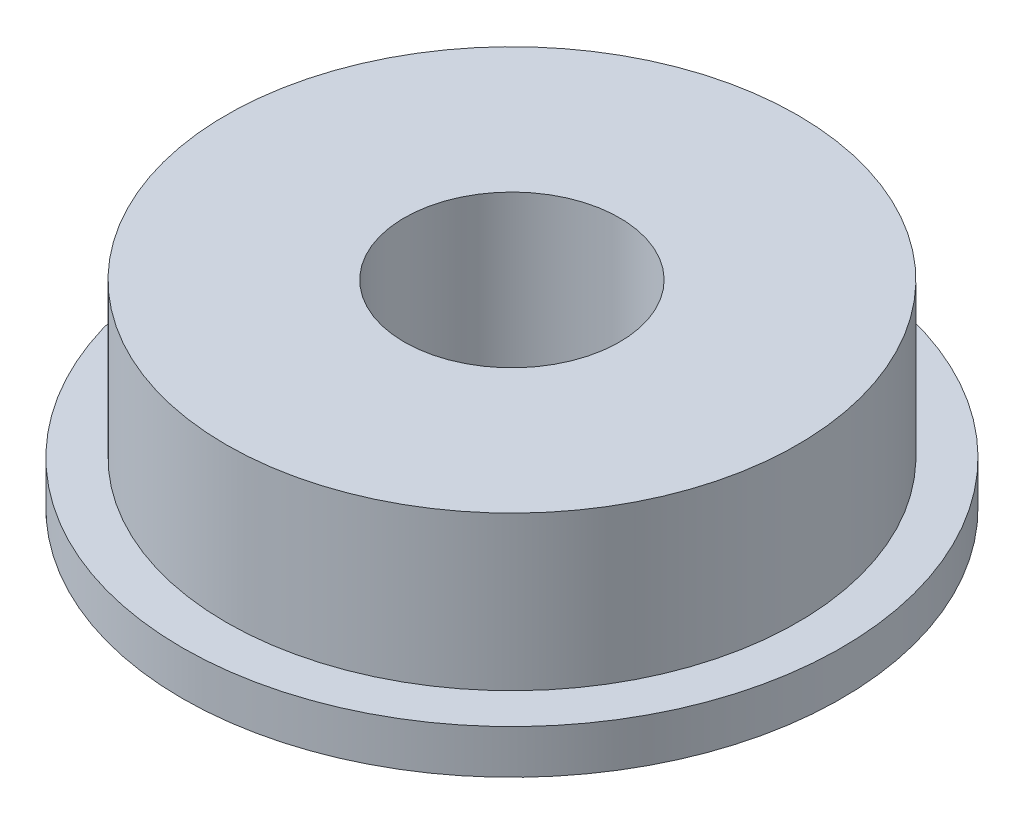
ISO-10303-21;
HEADER;
FILE_DESCRIPTION(('STEP AP214'),'2;1');
FILE_NAME('part.step','',(''),(''),'','','');
FILE_SCHEMA(('AUTOMOTIVE_DESIGN { 1 0 10303 214 1 1 1 1 }'));
ENDSEC;
DATA;
#1=APPLICATION_CONTEXT('core data for automotive mechanical design processes');
#2=APPLICATION_PROTOCOL_DEFINITION('international standard','automotive_design',2000,#1);
#3=PRODUCT_CONTEXT('',#1,'mechanical');
#4=PRODUCT('Part','Part','',(#3));
#5=PRODUCT_RELATED_PRODUCT_CATEGORY('part','',(#4));
#6=PRODUCT_DEFINITION_FORMATION('','',#4);
#7=PRODUCT_DEFINITION_CONTEXT('part definition',#1,'design');
#8=PRODUCT_DEFINITION('design','',#6,#7);
#9=PRODUCT_DEFINITION_SHAPE('','',#8);
#10=(LENGTH_UNIT() NAMED_UNIT(*) SI_UNIT(.MILLI.,.METRE.));
#11=(NAMED_UNIT(*) PLANE_ANGLE_UNIT() SI_UNIT($,.RADIAN.));
#12=(NAMED_UNIT(*) SI_UNIT($,.STERADIAN.) SOLID_ANGLE_UNIT());
#13=UNCERTAINTY_MEASURE_WITH_UNIT(LENGTH_MEASURE(1.E-05),#10,'distance_accuracy_value','');
#14=(GEOMETRIC_REPRESENTATION_CONTEXT(3) GLOBAL_UNCERTAINTY_ASSIGNED_CONTEXT((#13)) GLOBAL_UNIT_ASSIGNED_CONTEXT((#10,
#11,#12)) REPRESENTATION_CONTEXT('',''));
#15=CARTESIAN_POINT('',(0.,0.,0.));
#16=DIRECTION('',(0.,0.,1.));
#17=DIRECTION('',(1.,0.,0.));
#18=AXIS2_PLACEMENT_3D('',#15,#16,#17);
#19=CARTESIAN_POINT('',(0.,1.,0.));
#20=DIRECTION('',(0.,-1.,0.));
#21=DIRECTION('',(0.,0.,-1.));
#22=AXIS2_PLACEMENT_3D('',#19,#20,#21);
#23=CYLINDRICAL_SURFACE('',#22,7.5);
#24=CARTESIAN_POINT('',(0.,1.,0.));
#25=DIRECTION('',(0.,1.,0.));
#26=DIRECTION('',(0.,0.,1.));
#27=AXIS2_PLACEMENT_3D('',#24,#25,#26);
#28=CIRCLE('',#27,7.5);
#29=CARTESIAN_POINT('',(0.,1.,7.5));
#30=VERTEX_POINT('',#29);
#31=EDGE_CURVE('E44',#30,#30,#28,.T.);
#32=ORIENTED_EDGE('',*,*,#31,.F.);
#33=EDGE_LOOP('',(#32));
#34=FACE_BOUND('',#33,.T.);
#35=CARTESIAN_POINT('',(0.,0.,0.));
#36=DIRECTION('',(0.,1.,0.));
#37=DIRECTION('',(0.,0.,1.));
#38=AXIS2_PLACEMENT_3D('',#35,#36,#37);
#39=CIRCLE('',#38,7.5);
#40=CARTESIAN_POINT('',(0.,0.,7.5));
#41=VERTEX_POINT('',#40);
#42=EDGE_CURVE('E39',#41,#41,#39,.T.);
#43=ORIENTED_EDGE('',*,*,#42,.T.);
#44=EDGE_LOOP('',(#43));
#45=FACE_BOUND('',#44,.T.);
#46=ADVANCED_FACE('F36',(#34,#45),#23,.T.);
#47=CARTESIAN_POINT('',(0.,1.,0.));
#48=DIRECTION('',(0.,1.,0.));
#49=DIRECTION('',(0.,0.,1.));
#50=AXIS2_PLACEMENT_3D('',#47,#48,#49);
#51=PLANE('',#50);
#52=CARTESIAN_POINT('',(0.,1.,0.));
#53=DIRECTION('',(0.,1.,0.));
#54=DIRECTION('',(0.,0.,1.));
#55=AXIS2_PLACEMENT_3D('',#52,#53,#54);
#56=CIRCLE('',#55,6.5);
#57=CARTESIAN_POINT('',(0.,1.,6.5));
#58=VERTEX_POINT('',#57);
#59=EDGE_CURVE('E10',#58,#58,#56,.T.);
#60=ORIENTED_EDGE('',*,*,#59,.F.);
#61=EDGE_LOOP('',(#60));
#62=FACE_BOUND('',#61,.T.);
#63=ORIENTED_EDGE('',*,*,#31,.T.);
#64=EDGE_LOOP('',(#63));
#65=FACE_BOUND('',#64,.T.);
#66=ADVANCED_FACE('F81',(#62,#65),#51,.T.);
#67=CARTESIAN_POINT('',(0.,0.,0.));
#68=DIRECTION('',(0.,1.,0.));
#69=DIRECTION('',(0.,0.,1.));
#70=AXIS2_PLACEMENT_3D('',#67,#68,#69);
#71=PLANE('',#70);
#72=CARTESIAN_POINT('',(0.,0.,0.));
#73=DIRECTION('',(0.,1.,0.));
#74=DIRECTION('',(0.,0.,1.));
#75=AXIS2_PLACEMENT_3D('',#72,#73,#74);
#76=CIRCLE('',#75,2.45);
#77=CARTESIAN_POINT('',(0.,0.,2.45));
#78=VERTEX_POINT('',#77);
#79=EDGE_CURVE('E55',#78,#78,#76,.F.);
#80=ORIENTED_EDGE('',*,*,#79,.F.);
#81=EDGE_LOOP('',(#80));
#82=FACE_BOUND('',#81,.T.);
#83=ORIENTED_EDGE('',*,*,#42,.F.);
#84=EDGE_LOOP('',(#83));
#85=FACE_BOUND('',#84,.T.);
#86=ADVANCED_FACE('F74',(#82,#85),#71,.F.);
#87=CARTESIAN_POINT('',(0.,4.5,0.));
#88=DIRECTION('',(0.,-1.,0.));
#89=DIRECTION('',(0.,0.,-1.));
#90=AXIS2_PLACEMENT_3D('',#87,#88,#89);
#91=CYLINDRICAL_SURFACE('',#90,6.5);
#92=CARTESIAN_POINT('',(0.,4.5,0.));
#93=DIRECTION('',(0.,1.,0.));
#94=DIRECTION('',(0.,0.,1.));
#95=AXIS2_PLACEMENT_3D('',#92,#93,#94);
#96=CIRCLE('',#95,6.5);
#97=CARTESIAN_POINT('',(0.,4.5,6.5));
#98=VERTEX_POINT('',#97);
#99=EDGE_CURVE('E51',#98,#98,#96,.T.);
#100=ORIENTED_EDGE('',*,*,#99,.F.);
#101=EDGE_LOOP('',(#100));
#102=FACE_BOUND('',#101,.T.);
#103=ORIENTED_EDGE('',*,*,#59,.T.);
#104=EDGE_LOOP('',(#103));
#105=FACE_BOUND('',#104,.T.);
#106=ADVANCED_FACE('F69',(#102,#105),#91,.T.);
#107=CARTESIAN_POINT('',(0.,4.5,0.));
#108=DIRECTION('',(0.,1.,0.));
#109=DIRECTION('',(0.,0.,1.));
#110=AXIS2_PLACEMENT_3D('',#107,#108,#109);
#111=PLANE('',#110);
#112=CARTESIAN_POINT('',(0.,4.5,0.));
#113=DIRECTION('',(0.,1.,0.));
#114=DIRECTION('',(0.,0.,1.));
#115=AXIS2_PLACEMENT_3D('',#112,#113,#114);
#116=CIRCLE('',#115,2.45);
#117=CARTESIAN_POINT('',(0.,4.5,2.45));
#118=VERTEX_POINT('',#117);
#119=EDGE_CURVE('E59',#118,#118,#116,.T.);
#120=ORIENTED_EDGE('',*,*,#119,.F.);
#121=EDGE_LOOP('',(#120));
#122=FACE_BOUND('',#121,.T.);
#123=ORIENTED_EDGE('',*,*,#99,.T.);
#124=EDGE_LOOP('',(#123));
#125=FACE_BOUND('',#124,.T.);
#126=ADVANCED_FACE('F66',(#122,#125),#111,.T.);
#127=CARTESIAN_POINT('',(0.,-6.92964645562817,0.));
#128=DIRECTION('',(0.,1.,0.));
#129=DIRECTION('',(0.,0.,1.));
#130=AXIS2_PLACEMENT_3D('',#127,#128,#129);
#131=CYLINDRICAL_SURFACE('',#130,2.45);
#132=CARTESIAN_POINT('',(0.,0.,2.45));
#133=CARTESIAN_POINT('',(0.,0.0468749999999992,2.45));
#134=CARTESIAN_POINT('',(0.,0.0937499999999992,2.45));
#135=CARTESIAN_POINT('',(0.,0.187499999999999,2.45));
#136=CARTESIAN_POINT('',(0.,0.234374999999999,2.45));
#137=CARTESIAN_POINT('',(0.,0.328124999999999,2.45));
#138=CARTESIAN_POINT('',(0.,0.374999999999999,2.45));
#139=CARTESIAN_POINT('',(0.,0.46875,2.45));
#140=CARTESIAN_POINT('',(0.,0.515625,2.45));
#141=CARTESIAN_POINT('',(0.,0.609374999999999,2.45));
#142=CARTESIAN_POINT('',(0.,0.656249999999999,2.45));
#143=CARTESIAN_POINT('',(0.,0.749999999999999,2.45));
#144=CARTESIAN_POINT('',(0.,0.796874999999999,2.45));
#145=CARTESIAN_POINT('',(0.,0.890624999999999,2.45));
#146=CARTESIAN_POINT('',(0.,0.937499999999998,2.45));
#147=CARTESIAN_POINT('',(0.,1.03125,2.45));
#148=CARTESIAN_POINT('',(0.,1.078125,2.45));
#149=CARTESIAN_POINT('',(0.,1.171875,2.45));
#150=CARTESIAN_POINT('',(0.,1.21875,2.45));
#151=CARTESIAN_POINT('',(0.,1.3125,2.45));
#152=CARTESIAN_POINT('',(0.,1.359375,2.45));
#153=CARTESIAN_POINT('',(0.,1.453125,2.45));
#154=CARTESIAN_POINT('',(0.,1.5,2.45));
#155=CARTESIAN_POINT('',(0.,1.59375,2.45));
#156=CARTESIAN_POINT('',(0.,1.640625,2.45));
#157=CARTESIAN_POINT('',(0.,1.734375,2.45));
#158=CARTESIAN_POINT('',(0.,1.78125,2.45));
#159=CARTESIAN_POINT('',(0.,1.875,2.45));
#160=CARTESIAN_POINT('',(0.,1.921875,2.45));
#161=CARTESIAN_POINT('',(0.,2.015625,2.45));
#162=CARTESIAN_POINT('',(0.,2.0625,2.45));
#163=CARTESIAN_POINT('',(0.,2.15625,2.45));
#164=CARTESIAN_POINT('',(0.,2.203125,2.45));
#165=CARTESIAN_POINT('',(0.,2.296875,2.45));
#166=CARTESIAN_POINT('',(0.,2.34375,2.45));
#167=CARTESIAN_POINT('',(0.,2.4375,2.45));
#168=CARTESIAN_POINT('',(0.,2.484375,2.45));
#169=CARTESIAN_POINT('',(0.,2.578125,2.45));
#170=CARTESIAN_POINT('',(0.,2.625,2.45));
#171=CARTESIAN_POINT('',(0.,2.71875,2.45));
#172=CARTESIAN_POINT('',(0.,2.765625,2.45));
#173=CARTESIAN_POINT('',(0.,2.859375,2.45));
#174=CARTESIAN_POINT('',(0.,2.90625,2.45));
#175=CARTESIAN_POINT('',(0.,3.,2.45));
#176=CARTESIAN_POINT('',(0.,3.046875,2.45));
#177=CARTESIAN_POINT('',(0.,3.140625,2.45));
#178=CARTESIAN_POINT('',(0.,3.1875,2.45));
#179=CARTESIAN_POINT('',(0.,3.28125,2.45));
#180=CARTESIAN_POINT('',(0.,3.328125,2.45));
#181=CARTESIAN_POINT('',(0.,3.421875,2.45));
#182=CARTESIAN_POINT('',(0.,3.46875,2.45));
#183=CARTESIAN_POINT('',(0.,3.5625,2.45));
#184=CARTESIAN_POINT('',(0.,3.609375,2.45));
#185=CARTESIAN_POINT('',(0.,3.703125,2.45));
#186=CARTESIAN_POINT('',(0.,3.75,2.45));
#187=CARTESIAN_POINT('',(0.,3.84375,2.45));
#188=CARTESIAN_POINT('',(0.,3.890625,2.45));
#189=CARTESIAN_POINT('',(0.,3.984375,2.45));
#190=CARTESIAN_POINT('',(0.,4.03125,2.45));
#191=CARTESIAN_POINT('',(0.,4.125,2.45));
#192=CARTESIAN_POINT('',(0.,4.171875,2.45));
#193=CARTESIAN_POINT('',(0.,4.265625,2.45));
#194=CARTESIAN_POINT('',(0.,4.3125,2.45));
#195=CARTESIAN_POINT('',(0.,4.40625,2.45));
#196=CARTESIAN_POINT('',(0.,4.453125,2.45));
#197=CARTESIAN_POINT('',(0.,4.5,2.45));
#198=B_SPLINE_CURVE_WITH_KNOTS('',3,(#132,#133,#134,#135,#136,#137,#138,#139,#140,#141,#142,
#143,#144,#145,#146,#147,#148,#149,#150,#151,#152,#153,#154,#155,#156,#157,#158,#159,#160,#161,
#162,#163,#164,#165,#166,#167,#168,#169,#170,#171,#172,#173,#174,#175,#176,#177,#178,#179,#180,
#181,#182,#183,#184,#185,#186,#187,#188,#189,#190,#191,#192,#193,#194,#195,#196,#197),
.UNSPECIFIED.,.F.,.F.,(4,2,2,2,2,2,2,2,2,2,2,2,2,2,2,2,2,2,2,2,2,2,2,2,2,2,2,2,2,2,2,2,4),(0.,
0.140625,0.28125,0.421875,0.5625,0.703125,0.84375,0.984374999999998,1.125,1.265625,1.40625,
1.546875,1.6875,1.828125,1.96875,2.109375,2.25,2.390625,2.53125,2.671875,2.8125,2.953125,
3.09375,3.234375,3.375,3.515625,3.65625,3.796875,3.9375,4.078125,4.21875,4.359375,4.5),.UNSPECIFIED.);
#199=EDGE_CURVE('BSEAM64',#78,#118,#198,.T.);
#200=ORIENTED_EDGE('',*,*,#79,.T.);
#201=ORIENTED_EDGE('',*,*,#119,.T.);
#202=ORIENTED_EDGE('',*,*,#199,.T.);
#203=ORIENTED_EDGE('',*,*,#199,.F.);
#204=EDGE_LOOP('',(#200,#202,#201,#203));
#205=FACE_BOUND('',#204,.T.);
#206=ADVANCED_FACE('F64',(#205),#131,.F.);
#207=CLOSED_SHELL('',(#46,#66,#86,#106,#126,#206));
#208=MANIFOLD_SOLID_BREP('B2',#207);
#209=ADVANCED_BREP_SHAPE_REPRESENTATION('',(#18,#208),#14);
#210=SHAPE_DEFINITION_REPRESENTATION(#9,#209);
ENDSEC;
END-ISO-10303-21;
